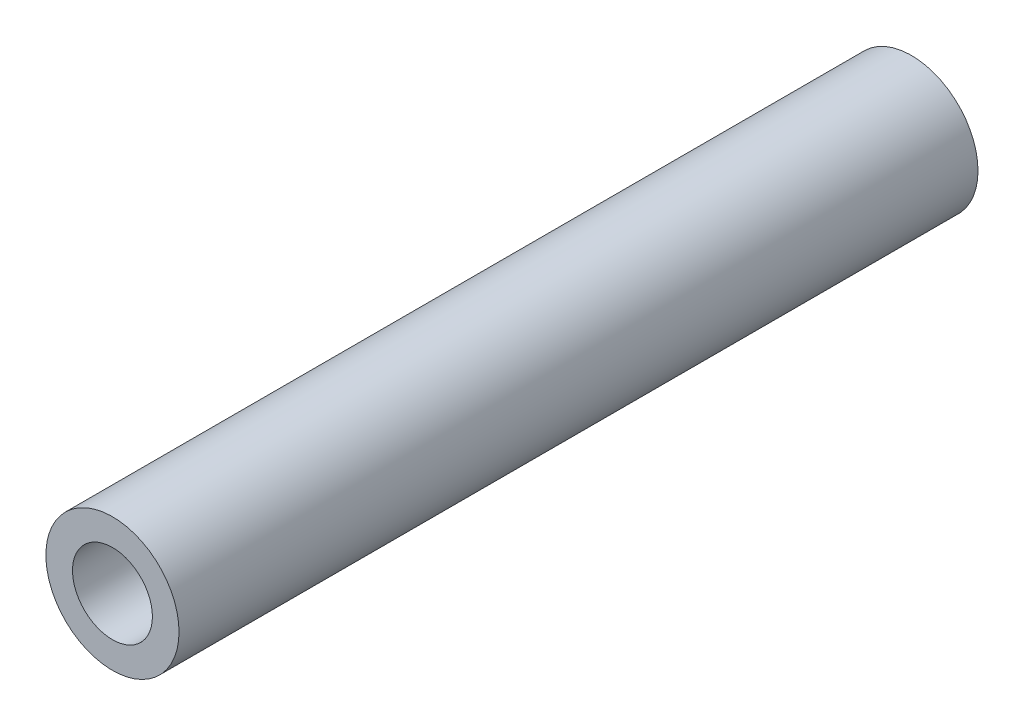
ISO-10303-21;
HEADER;
FILE_DESCRIPTION(('STEP AP214'),'2;1');
FILE_NAME('part.step','',(''),(''),'','','');
FILE_SCHEMA(('AUTOMOTIVE_DESIGN { 1 0 10303 214 1 1 1 1 }'));
ENDSEC;
DATA;
#1=APPLICATION_CONTEXT('core data for automotive mechanical design processes');
#2=APPLICATION_PROTOCOL_DEFINITION('international standard','automotive_design',2000,#1);
#3=PRODUCT_CONTEXT('',#1,'mechanical');
#4=PRODUCT('Part','Part','',(#3));
#5=PRODUCT_RELATED_PRODUCT_CATEGORY('part','',(#4));
#6=PRODUCT_DEFINITION_FORMATION('','',#4);
#7=PRODUCT_DEFINITION_CONTEXT('part definition',#1,'design');
#8=PRODUCT_DEFINITION('design','',#6,#7);
#9=PRODUCT_DEFINITION_SHAPE('','',#8);
#10=(LENGTH_UNIT() NAMED_UNIT(*) SI_UNIT(.MILLI.,.METRE.));
#11=(NAMED_UNIT(*) PLANE_ANGLE_UNIT() SI_UNIT($,.RADIAN.));
#12=(NAMED_UNIT(*) SI_UNIT($,.STERADIAN.) SOLID_ANGLE_UNIT());
#13=UNCERTAINTY_MEASURE_WITH_UNIT(LENGTH_MEASURE(1.E-05),#10,'distance_accuracy_value','');
#14=(GEOMETRIC_REPRESENTATION_CONTEXT(3) GLOBAL_UNCERTAINTY_ASSIGNED_CONTEXT((#13)) GLOBAL_UNIT_ASSIGNED_CONTEXT((#10,
#11,#12)) REPRESENTATION_CONTEXT('',''));
#15=CARTESIAN_POINT('',(0.,0.,0.));
#16=DIRECTION('',(0.,0.,1.));
#17=DIRECTION('',(1.,0.,0.));
#18=AXIS2_PLACEMENT_3D('',#15,#16,#17);
#19=CARTESIAN_POINT('',(0.,0.,30.));
#20=DIRECTION('',(0.,0.,-1.));
#21=DIRECTION('',(-1.,0.,0.));
#22=AXIS2_PLACEMENT_3D('',#19,#20,#21);
#23=CYLINDRICAL_SURFACE('',#22,2.5);
#24=CARTESIAN_POINT('',(0.,0.,30.));
#25=DIRECTION('',(0.,0.,1.));
#26=DIRECTION('',(1.,0.,0.));
#27=AXIS2_PLACEMENT_3D('',#24,#25,#26);
#28=CIRCLE('',#27,2.5);
#29=CARTESIAN_POINT('',(2.5,0.,30.));
#30=VERTEX_POINT('',#29);
#31=EDGE_CURVE('E10',#30,#30,#28,.T.);
#32=ORIENTED_EDGE('',*,*,#31,.F.);
#33=EDGE_LOOP('',(#32));
#34=FACE_BOUND('',#33,.T.);
#35=CARTESIAN_POINT('',(0.,0.,0.));
#36=DIRECTION('',(0.,0.,1.));
#37=DIRECTION('',(1.,0.,0.));
#38=AXIS2_PLACEMENT_3D('',#35,#36,#37);
#39=CIRCLE('',#38,2.5);
#40=CARTESIAN_POINT('',(2.5,0.,0.));
#41=VERTEX_POINT('',#40);
#42=EDGE_CURVE('E34',#41,#41,#39,.T.);
#43=ORIENTED_EDGE('',*,*,#42,.T.);
#44=EDGE_LOOP('',(#43));
#45=FACE_BOUND('',#44,.T.);
#46=ADVANCED_FACE('F31',(#34,#45),#23,.T.);
#47=CARTESIAN_POINT('',(0.,0.,30.));
#48=DIRECTION('',(0.,0.,1.));
#49=DIRECTION('',(1.,0.,0.));
#50=AXIS2_PLACEMENT_3D('',#47,#48,#49);
#51=PLANE('',#50);
#52=CARTESIAN_POINT('',(0.,0.,30.));
#53=DIRECTION('',(0.,0.,1.));
#54=DIRECTION('',(1.,0.,0.));
#55=AXIS2_PLACEMENT_3D('',#52,#53,#54);
#56=CIRCLE('',#55,1.5);
#57=CARTESIAN_POINT('',(1.5,0.,30.));
#58=VERTEX_POINT('',#57);
#59=EDGE_CURVE('E43',#58,#58,#56,.T.);
#60=ORIENTED_EDGE('',*,*,#59,.F.);
#61=EDGE_LOOP('',(#60));
#62=FACE_BOUND('',#61,.T.);
#63=ORIENTED_EDGE('',*,*,#31,.T.);
#64=EDGE_LOOP('',(#63));
#65=FACE_BOUND('',#64,.T.);
#66=ADVANCED_FACE('F58',(#62,#65),#51,.T.);
#67=CARTESIAN_POINT('',(0.,0.,0.));
#68=DIRECTION('',(0.,0.,1.));
#69=DIRECTION('',(1.,0.,0.));
#70=AXIS2_PLACEMENT_3D('',#67,#68,#69);
#71=PLANE('',#70);
#72=ORIENTED_EDGE('',*,*,#42,.F.);
#73=EDGE_LOOP('',(#72));
#74=FACE_BOUND('',#73,.T.);
#75=ADVANCED_FACE('F54',(#74),#71,.F.);
#76=CARTESIAN_POINT('',(0.,0.,14.));
#77=DIRECTION('',(0.,0.,1.));
#78=DIRECTION('',(1.,0.,0.));
#79=AXIS2_PLACEMENT_3D('',#76,#77,#78);
#80=CYLINDRICAL_SURFACE('',#79,1.5);
#81=CARTESIAN_POINT('',(0.,0.,14.));
#82=DIRECTION('',(0.,0.,1.));
#83=DIRECTION('',(1.,0.,0.));
#84=AXIS2_PLACEMENT_3D('',#81,#82,#83);
#85=CIRCLE('',#84,1.5);
#86=CARTESIAN_POINT('',(1.5,0.,14.));
#87=VERTEX_POINT('',#86);
#88=EDGE_CURVE('E41',#87,#87,#85,.T.);
#89=ORIENTED_EDGE('',*,*,#88,.F.);
#90=EDGE_LOOP('',(#89));
#91=FACE_BOUND('',#90,.T.);
#92=ORIENTED_EDGE('',*,*,#59,.T.);
#93=EDGE_LOOP('',(#92));
#94=FACE_BOUND('',#93,.T.);
#95=ADVANCED_FACE('F51',(#91,#94),#80,.F.);
#96=CARTESIAN_POINT('',(0.,0.,14.));
#97=DIRECTION('',(0.,0.,1.));
#98=DIRECTION('',(1.,0.,0.));
#99=AXIS2_PLACEMENT_3D('',#96,#97,#98);
#100=PLANE('',#99);
#101=ORIENTED_EDGE('',*,*,#88,.T.);
#102=EDGE_LOOP('',(#101));
#103=FACE_BOUND('',#102,.T.);
#104=ADVANCED_FACE('F49',(#103),#100,.T.);
#105=CLOSED_SHELL('',(#46,#66,#75,#95,#104));
#106=MANIFOLD_SOLID_BREP('B2',#105);
#107=ADVANCED_BREP_SHAPE_REPRESENTATION('',(#18,#106),#14);
#108=SHAPE_DEFINITION_REPRESENTATION(#9,#107);
ENDSEC;
END-ISO-10303-21;
